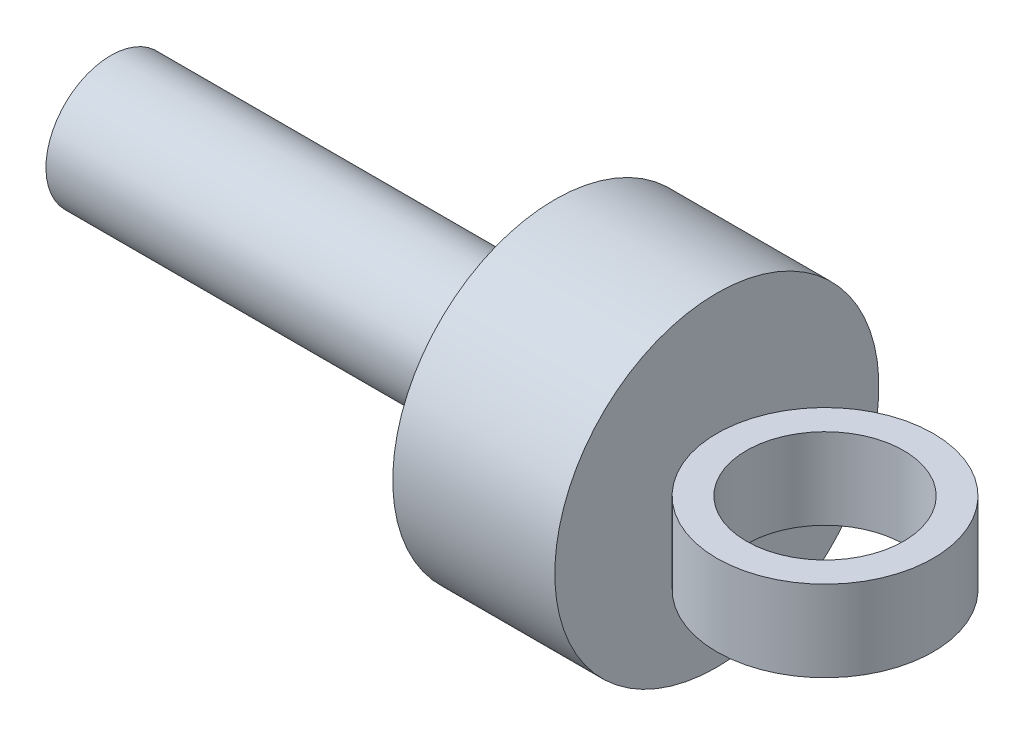
ISO-10303-21;
HEADER;
FILE_DESCRIPTION(('STEP AP214'),'2;1');
FILE_NAME('part.step','',(''),(''),'','','');
FILE_SCHEMA(('AUTOMOTIVE_DESIGN { 1 0 10303 214 1 1 1 1 }'));
ENDSEC;
DATA;
#1=APPLICATION_CONTEXT('core data for automotive mechanical design processes');
#2=APPLICATION_PROTOCOL_DEFINITION('international standard','automotive_design',2000,#1);
#3=PRODUCT_CONTEXT('',#1,'mechanical');
#4=PRODUCT('Part','Part','',(#3));
#5=PRODUCT_RELATED_PRODUCT_CATEGORY('part','',(#4));
#6=PRODUCT_DEFINITION_FORMATION('','',#4);
#7=PRODUCT_DEFINITION_CONTEXT('part definition',#1,'design');
#8=PRODUCT_DEFINITION('design','',#6,#7);
#9=PRODUCT_DEFINITION_SHAPE('','',#8);
#10=(LENGTH_UNIT() NAMED_UNIT(*) SI_UNIT(.MILLI.,.METRE.));
#11=(NAMED_UNIT(*) PLANE_ANGLE_UNIT() SI_UNIT($,.RADIAN.));
#12=(NAMED_UNIT(*) SI_UNIT($,.STERADIAN.) SOLID_ANGLE_UNIT());
#13=UNCERTAINTY_MEASURE_WITH_UNIT(LENGTH_MEASURE(1.E-05),#10,'distance_accuracy_value','');
#14=(GEOMETRIC_REPRESENTATION_CONTEXT(3) GLOBAL_UNCERTAINTY_ASSIGNED_CONTEXT((#13)) GLOBAL_UNIT_ASSIGNED_CONTEXT((#10,
#11,#12)) REPRESENTATION_CONTEXT('',''));
#15=CARTESIAN_POINT('',(0.,0.,0.));
#16=DIRECTION('',(0.,0.,1.));
#17=DIRECTION('',(1.,0.,0.));
#18=AXIS2_PLACEMENT_3D('',#15,#16,#17);
#19=CARTESIAN_POINT('',(20.03,7.5,0.));
#20=DIRECTION('',(0.,1.,0.));
#21=DIRECTION('',(0.,0.,1.));
#22=AXIS2_PLACEMENT_3D('',#19,#20,#21);
#23=PLANE('',#22);
#24=CARTESIAN_POINT('',(20.03,7.5,0.));
#25=DIRECTION('',(0.,1.,0.));
#26=DIRECTION('',(0.,0.,1.));
#27=AXIS2_PLACEMENT_3D('',#24,#25,#26);
#28=CIRCLE('',#27,20.03);
#29=CARTESIAN_POINT('',(20.03,7.5,20.03));
#30=VERTEX_POINT('',#29);
#31=EDGE_CURVE('E11',#30,#30,#28,.T.);
#32=ORIENTED_EDGE('',*,*,#31,.T.);
#33=EDGE_LOOP('',(#32));
#34=FACE_BOUND('',#33,.T.);
#35=CARTESIAN_POINT('',(20.03,7.5,0.));
#36=DIRECTION('',(0.,1.,0.));
#37=DIRECTION('',(0.,0.,1.));
#38=AXIS2_PLACEMENT_3D('',#35,#36,#37);
#39=CIRCLE('',#38,14.555);
#40=CARTESIAN_POINT('',(20.03,7.5,14.555));
#41=VERTEX_POINT('',#40);
#42=EDGE_CURVE('E53',#41,#41,#39,.T.);
#43=ORIENTED_EDGE('',*,*,#42,.F.);
#44=EDGE_LOOP('',(#43));
#45=FACE_BOUND('',#44,.T.);
#46=ADVANCED_FACE('F42',(#34,#45),#23,.T.);
#47=CARTESIAN_POINT('',(20.03,-7.5,0.));
#48=DIRECTION('',(0.,1.,0.));
#49=DIRECTION('',(0.,0.,1.));
#50=AXIS2_PLACEMENT_3D('',#47,#48,#49);
#51=PLANE('',#50);
#52=CARTESIAN_POINT('',(20.03,-7.5,0.));
#53=DIRECTION('',(0.,1.,0.));
#54=DIRECTION('',(0.,0.,1.));
#55=AXIS2_PLACEMENT_3D('',#52,#53,#54);
#56=CIRCLE('',#55,20.03);
#57=CARTESIAN_POINT('',(20.03,-7.5,20.03));
#58=VERTEX_POINT('',#57);
#59=EDGE_CURVE('E46',#58,#58,#56,.T.);
#60=ORIENTED_EDGE('',*,*,#59,.F.);
#61=EDGE_LOOP('',(#60));
#62=FACE_BOUND('',#61,.T.);
#63=CARTESIAN_POINT('',(20.03,-7.5,0.));
#64=DIRECTION('',(0.,1.,0.));
#65=DIRECTION('',(0.,0.,1.));
#66=AXIS2_PLACEMENT_3D('',#63,#64,#65);
#67=CIRCLE('',#66,14.555);
#68=CARTESIAN_POINT('',(20.03,-7.5,14.555));
#69=VERTEX_POINT('',#68);
#70=EDGE_CURVE('E55',#69,#69,#67,.T.);
#71=ORIENTED_EDGE('',*,*,#70,.T.);
#72=EDGE_LOOP('',(#71));
#73=FACE_BOUND('',#72,.T.);
#74=ADVANCED_FACE('F65',(#62,#73),#51,.F.);
#75=CARTESIAN_POINT('',(20.03,7.5,0.));
#76=DIRECTION('',(0.,-1.,0.));
#77=DIRECTION('',(0.,0.,-1.));
#78=AXIS2_PLACEMENT_3D('',#75,#76,#77);
#79=CYLINDRICAL_SURFACE('',#78,20.03);
#80=ORIENTED_EDGE('',*,*,#31,.F.);
#81=EDGE_LOOP('',(#80));
#82=FACE_BOUND('',#81,.T.);
#83=ORIENTED_EDGE('',*,*,#59,.T.);
#84=EDGE_LOOP('',(#83));
#85=FACE_BOUND('',#84,.T.);
#86=ADVANCED_FACE('F44',(#82,#85),#79,.T.);
#87=CARTESIAN_POINT('',(20.03,7.5,0.));
#88=DIRECTION('',(0.,-1.,0.));
#89=DIRECTION('',(0.,0.,-1.));
#90=AXIS2_PLACEMENT_3D('',#87,#88,#89);
#91=CYLINDRICAL_SURFACE('',#90,14.555);
#92=ORIENTED_EDGE('',*,*,#42,.T.);
#93=EDGE_LOOP('',(#92));
#94=FACE_BOUND('',#93,.T.);
#95=ORIENTED_EDGE('',*,*,#70,.F.);
#96=EDGE_LOOP('',(#95));
#97=FACE_BOUND('',#96,.T.);
#98=ADVANCED_FACE('F61',(#94,#97),#91,.F.);
#99=CLOSED_SHELL('',(#46,#74,#86,#98));
#100=MANIFOLD_SOLID_BREP('B2',#99);
#101=CARTESIAN_POINT('',(0.,30.,0.));
#102=DIRECTION('',(1.,0.,0.));
#103=DIRECTION('',(0.,1.,0.));
#104=AXIS2_PLACEMENT_3D('',#101,#102,#103);
#105=PLANE('',#104);
#106=CARTESIAN_POINT('',(0.,0.,0.));
#107=DIRECTION('',(1.,0.,0.));
#108=DIRECTION('',(0.,1.,0.));
#109=AXIS2_PLACEMENT_3D('',#106,#107,#108);
#110=CIRCLE('',#109,30.);
#111=CARTESIAN_POINT('',(0.,30.,0.));
#112=VERTEX_POINT('',#111);
#113=EDGE_CURVE('E125',#112,#112,#110,.T.);
#114=ORIENTED_EDGE('',*,*,#113,.T.);
#115=EDGE_LOOP('',(#114));
#116=FACE_BOUND('',#115,.T.);
#117=ADVANCED_FACE('F103',(#116),#105,.T.);
#118=CARTESIAN_POINT('',(-112.2,0.,0.));
#119=DIRECTION('',(-1.,0.,0.));
#120=DIRECTION('',(0.,-1.,0.));
#121=AXIS2_PLACEMENT_3D('',#118,#119,#120);
#122=PLANE('',#121);
#123=CARTESIAN_POINT('',(-112.2,0.,0.));
#124=DIRECTION('',(1.,0.,0.));
#125=DIRECTION('',(0.,1.,0.));
#126=AXIS2_PLACEMENT_3D('',#123,#124,#125);
#127=CIRCLE('',#126,12.);
#128=CARTESIAN_POINT('',(-112.2,12.,0.));
#129=VERTEX_POINT('',#128);
#130=EDGE_CURVE('E41',#129,#129,#127,.T.);
#131=ORIENTED_EDGE('',*,*,#130,.F.);
#132=EDGE_LOOP('',(#131));
#133=FACE_BOUND('',#132,.T.);
#134=ADVANCED_FACE('F142',(#133),#122,.T.);
#135=CARTESIAN_POINT('',(0.,0.,0.));
#136=DIRECTION('',(1.,0.,0.));
#137=DIRECTION('',(0.,1.,0.));
#138=AXIS2_PLACEMENT_3D('',#135,#136,#137);
#139=CYLINDRICAL_SURFACE('',#138,12.);
#140=ORIENTED_EDGE('',*,*,#130,.T.);
#141=EDGE_LOOP('',(#140));
#142=FACE_BOUND('',#141,.T.);
#143=CARTESIAN_POINT('',(-1.,0.,0.));
#144=DIRECTION('',(1.,0.,0.));
#145=DIRECTION('',(0.,1.,0.));
#146=AXIS2_PLACEMENT_3D('',#143,#144,#145);
#147=CIRCLE('',#146,12.);
#148=CARTESIAN_POINT('',(-1.00000000000001,12.,0.));
#149=VERTEX_POINT('',#148);
#150=EDGE_CURVE('E109',#149,#149,#147,.T.);
#151=ORIENTED_EDGE('',*,*,#150,.F.);
#152=EDGE_LOOP('',(#151));
#153=FACE_BOUND('',#152,.T.);
#154=ADVANCED_FACE('F146',(#142,#153),#139,.T.);
#155=CARTESIAN_POINT('',(-1.00000000000001,12.,0.));
#156=DIRECTION('',(-1.,0.,0.));
#157=DIRECTION('',(0.,-1.,0.));
#158=AXIS2_PLACEMENT_3D('',#155,#156,#157);
#159=PLANE('',#158);
#160=ORIENTED_EDGE('',*,*,#150,.T.);
#161=EDGE_LOOP('',(#160));
#162=FACE_BOUND('',#161,.T.);
#163=CARTESIAN_POINT('',(-1.,0.,0.));
#164=DIRECTION('',(1.,0.,0.));
#165=DIRECTION('',(0.,1.,0.));
#166=AXIS2_PLACEMENT_3D('',#163,#164,#165);
#167=CIRCLE('',#166,29.);
#168=CARTESIAN_POINT('',(-1.00000000000001,29.,0.));
#169=VERTEX_POINT('',#168);
#170=EDGE_CURVE('E113',#169,#169,#167,.T.);
#171=ORIENTED_EDGE('',*,*,#170,.F.);
#172=EDGE_LOOP('',(#171));
#173=FACE_BOUND('',#172,.T.);
#174=ADVANCED_FACE('F151',(#162,#173),#159,.T.);
#175=CARTESIAN_POINT('',(0.,0.,0.));
#176=DIRECTION('',(1.,0.,0.));
#177=DIRECTION('',(0.,1.,0.));
#178=AXIS2_PLACEMENT_3D('',#175,#176,#177);
#179=CYLINDRICAL_SURFACE('',#178,29.);
#180=ORIENTED_EDGE('',*,*,#170,.T.);
#181=EDGE_LOOP('',(#180));
#182=FACE_BOUND('',#181,.T.);
#183=CARTESIAN_POINT('',(-30.,0.,0.));
#184=DIRECTION('',(1.,0.,0.));
#185=DIRECTION('',(0.,1.,0.));
#186=AXIS2_PLACEMENT_3D('',#183,#184,#185);
#187=CIRCLE('',#186,29.);
#188=CARTESIAN_POINT('',(-30.,29.,0.));
#189=VERTEX_POINT('',#188);
#190=EDGE_CURVE('E117',#189,#189,#187,.T.);
#191=ORIENTED_EDGE('',*,*,#190,.F.);
#192=EDGE_LOOP('',(#191));
#193=FACE_BOUND('',#192,.T.);
#194=ADVANCED_FACE('F138',(#182,#193),#179,.F.);
#195=CARTESIAN_POINT('',(-30.,29.,0.));
#196=DIRECTION('',(-1.,0.,0.));
#197=DIRECTION('',(0.,-1.,0.));
#198=AXIS2_PLACEMENT_3D('',#195,#196,#197);
#199=PLANE('',#198);
#200=ORIENTED_EDGE('',*,*,#190,.T.);
#201=EDGE_LOOP('',(#200));
#202=FACE_BOUND('',#201,.T.);
#203=CARTESIAN_POINT('',(-30.,0.,0.));
#204=DIRECTION('',(1.,0.,0.));
#205=DIRECTION('',(0.,1.,0.));
#206=AXIS2_PLACEMENT_3D('',#203,#204,#205);
#207=CIRCLE('',#206,30.);
#208=CARTESIAN_POINT('',(-30.,30.,0.));
#209=VERTEX_POINT('',#208);
#210=EDGE_CURVE('E122',#209,#209,#207,.T.);
#211=ORIENTED_EDGE('',*,*,#210,.F.);
#212=EDGE_LOOP('',(#211));
#213=FACE_BOUND('',#212,.T.);
#214=ADVANCED_FACE('F132',(#202,#213),#199,.T.);
#215=CARTESIAN_POINT('',(0.,0.,0.));
#216=DIRECTION('',(1.,0.,0.));
#217=DIRECTION('',(0.,1.,0.));
#218=AXIS2_PLACEMENT_3D('',#215,#216,#217);
#219=CYLINDRICAL_SURFACE('',#218,30.);
#220=ORIENTED_EDGE('',*,*,#210,.T.);
#221=EDGE_LOOP('',(#220));
#222=FACE_BOUND('',#221,.T.);
#223=ORIENTED_EDGE('',*,*,#113,.F.);
#224=EDGE_LOOP('',(#223));
#225=FACE_BOUND('',#224,.T.);
#226=ADVANCED_FACE('F130',(#222,#225),#219,.T.);
#227=CLOSED_SHELL('',(#117,#134,#154,#174,#194,#214,#226));
#228=MANIFOLD_SOLID_BREP('B6',#227);
#229=ADVANCED_BREP_SHAPE_REPRESENTATION('',(#18,#100,#228),#14);
#230=SHAPE_DEFINITION_REPRESENTATION(#9,#229);
ENDSEC;
END-ISO-10303-21;
